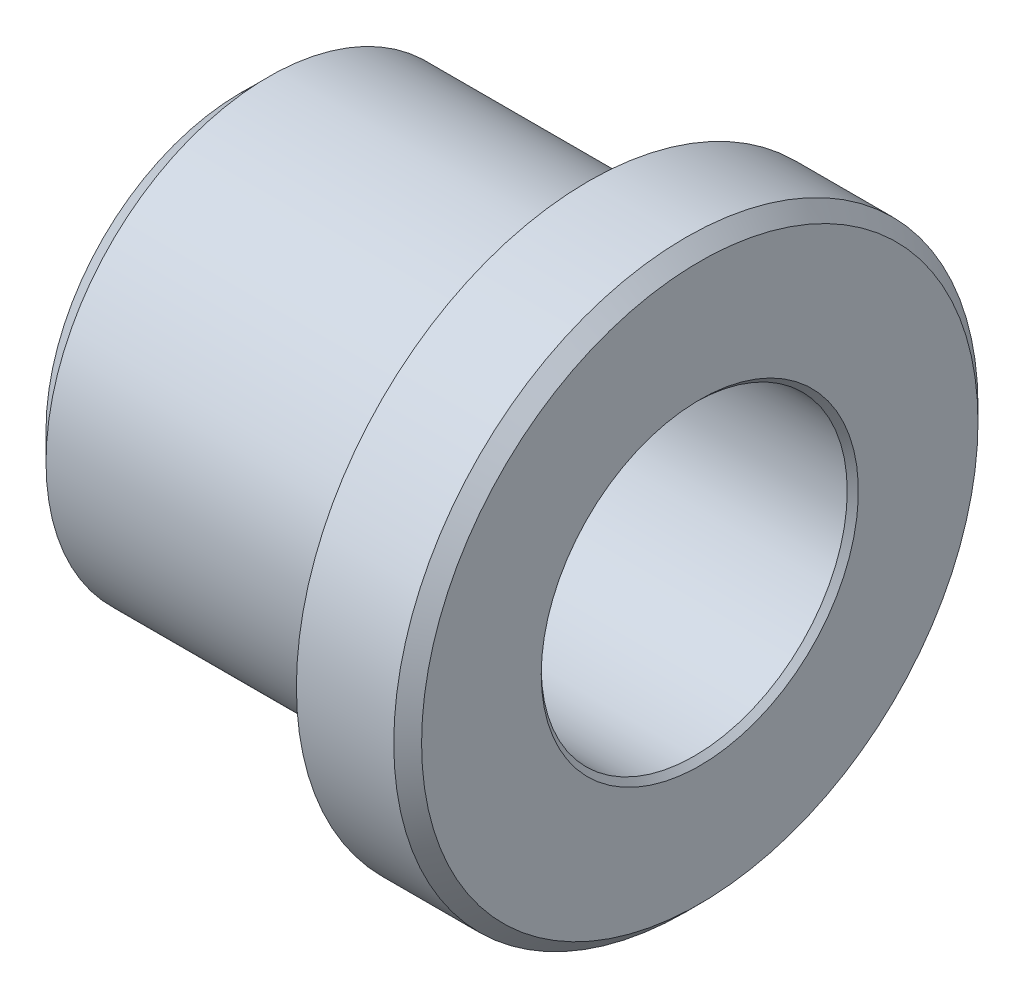
ISO-10303-21;
HEADER;
FILE_DESCRIPTION(('STEP AP214'),'2;1');
FILE_NAME('part.step','',(''),(''),'','','');
FILE_SCHEMA(('AUTOMOTIVE_DESIGN { 1 0 10303 214 1 1 1 1 }'));
ENDSEC;
DATA;
#1=APPLICATION_CONTEXT('core data for automotive mechanical design processes');
#2=APPLICATION_PROTOCOL_DEFINITION('international standard','automotive_design',2000,#1);
#3=PRODUCT_CONTEXT('',#1,'mechanical');
#4=PRODUCT('Part','Part','',(#3));
#5=PRODUCT_RELATED_PRODUCT_CATEGORY('part','',(#4));
#6=PRODUCT_DEFINITION_FORMATION('','',#4);
#7=PRODUCT_DEFINITION_CONTEXT('part definition',#1,'design');
#8=PRODUCT_DEFINITION('design','',#6,#7);
#9=PRODUCT_DEFINITION_SHAPE('','',#8);
#10=(LENGTH_UNIT() NAMED_UNIT(*) SI_UNIT(.MILLI.,.METRE.));
#11=(NAMED_UNIT(*) PLANE_ANGLE_UNIT() SI_UNIT($,.RADIAN.));
#12=(NAMED_UNIT(*) SI_UNIT($,.STERADIAN.) SOLID_ANGLE_UNIT());
#13=UNCERTAINTY_MEASURE_WITH_UNIT(LENGTH_MEASURE(1.E-05),#10,'distance_accuracy_value','');
#14=(GEOMETRIC_REPRESENTATION_CONTEXT(3) GLOBAL_UNCERTAINTY_ASSIGNED_CONTEXT((#13)) GLOBAL_UNIT_ASSIGNED_CONTEXT((#10,
#11,#12)) REPRESENTATION_CONTEXT('',''));
#15=CARTESIAN_POINT('',(0.,0.,0.));
#16=DIRECTION('',(0.,0.,1.));
#17=DIRECTION('',(1.,0.,0.));
#18=AXIS2_PLACEMENT_3D('',#15,#16,#17);
#19=CARTESIAN_POINT('',(12.5,10.5,0.));
#20=DIRECTION('',(1.,0.,0.));
#21=DIRECTION('',(0.,0.,-1.));
#22=AXIS2_PLACEMENT_3D('',#19,#20,#21);
#23=PLANE('',#22);
#24=CARTESIAN_POINT('',(12.5,0.,0.));
#25=DIRECTION('',(-1.,0.,0.));
#26=DIRECTION('',(0.,0.,1.));
#27=AXIS2_PLACEMENT_3D('',#24,#25,#26);
#28=CIRCLE('',#27,8.);
#29=CARTESIAN_POINT('',(12.5,0.,8.));
#30=VERTEX_POINT('',#29);
#31=EDGE_CURVE('E62',#30,#30,#28,.T.);
#32=ORIENTED_EDGE('',*,*,#31,.F.);
#33=EDGE_LOOP('',(#32));
#34=FACE_BOUND('',#33,.T.);
#35=CARTESIAN_POINT('',(12.5,0.,0.));
#36=DIRECTION('',(-1.,0.,0.));
#37=DIRECTION('',(0.,0.,1.));
#38=AXIS2_PLACEMENT_3D('',#35,#36,#37);
#39=CIRCLE('',#38,10.5);
#40=CARTESIAN_POINT('',(12.5,0.,10.5));
#41=VERTEX_POINT('',#40);
#42=EDGE_CURVE('E65',#41,#41,#39,.T.);
#43=ORIENTED_EDGE('',*,*,#42,.T.);
#44=EDGE_LOOP('',(#43));
#45=FACE_BOUND('',#44,.T.);
#46=ADVANCED_FACE('F31',(#34,#45),#23,.F.);
#47=CARTESIAN_POINT('',(11.3908279220779,0.,0.));
#48=DIRECTION('',(-1.,0.,0.));
#49=DIRECTION('',(0.,0.,1.));
#50=AXIS2_PLACEMENT_3D('',#47,#48,#49);
#51=CYLINDRICAL_SURFACE('',#50,8.);
#52=CARTESIAN_POINT('',(1.00000000000001,0.,0.));
#53=DIRECTION('',(1.,0.,0.));
#54=DIRECTION('',(0.,0.,-1.));
#55=AXIS2_PLACEMENT_3D('',#52,#53,#54);
#56=CIRCLE('',#55,8.);
#57=CARTESIAN_POINT('',(1.00000000000001,0.,-8.));
#58=VERTEX_POINT('',#57);
#59=EDGE_CURVE('E50',#58,#58,#56,.T.);
#60=ORIENTED_EDGE('',*,*,#59,.T.);
#61=EDGE_LOOP('',(#60));
#62=FACE_BOUND('',#61,.T.);
#63=ORIENTED_EDGE('',*,*,#31,.T.);
#64=EDGE_LOOP('',(#63));
#65=FACE_BOUND('',#64,.T.);
#66=ADVANCED_FACE('F86',(#62,#65),#51,.T.);
#67=CARTESIAN_POINT('',(0.,8.,0.));
#68=DIRECTION('',(1.,0.,0.));
#69=DIRECTION('',(0.,0.,-1.));
#70=AXIS2_PLACEMENT_3D('',#67,#68,#69);
#71=PLANE('',#70);
#72=CARTESIAN_POINT('',(0.,0.,0.));
#73=DIRECTION('',(1.,0.,0.));
#74=DIRECTION('',(0.,0.,-1.));
#75=AXIS2_PLACEMENT_3D('',#72,#73,#74);
#76=CIRCLE('',#75,5.7);
#77=CARTESIAN_POINT('',(0.,0.,-5.7));
#78=VERTEX_POINT('',#77);
#79=EDGE_CURVE('E37',#78,#78,#76,.T.);
#80=ORIENTED_EDGE('',*,*,#79,.T.);
#81=EDGE_LOOP('',(#80));
#82=FACE_BOUND('',#81,.T.);
#83=CARTESIAN_POINT('',(0.,0.,0.));
#84=DIRECTION('',(1.,0.,0.));
#85=DIRECTION('',(0.,0.,-1.));
#86=AXIS2_PLACEMENT_3D('',#83,#84,#85);
#87=CIRCLE('',#86,6.99999999999998);
#88=CARTESIAN_POINT('',(0.,0.,-6.99999999999998));
#89=VERTEX_POINT('',#88);
#90=EDGE_CURVE('E53',#89,#89,#87,.F.);
#91=ORIENTED_EDGE('',*,*,#90,.T.);
#92=EDGE_LOOP('',(#91));
#93=FACE_BOUND('',#92,.T.);
#94=ADVANCED_FACE('F91',(#82,#93),#71,.F.);
#95=CARTESIAN_POINT('',(11.3908279220779,0.,0.));
#96=DIRECTION('',(-1.,0.,0.));
#97=DIRECTION('',(0.,0.,1.));
#98=AXIS2_PLACEMENT_3D('',#95,#96,#97);
#99=CYLINDRICAL_SURFACE('',#98,5.5);
#100=CARTESIAN_POINT('',(0.200000000000004,0.,0.));
#101=DIRECTION('',(1.,0.,0.));
#102=DIRECTION('',(0.,0.,-1.));
#103=AXIS2_PLACEMENT_3D('',#100,#101,#102);
#104=CIRCLE('',#103,5.5);
#105=CARTESIAN_POINT('',(0.200000000000004,0.,-5.5));
#106=VERTEX_POINT('',#105);
#107=EDGE_CURVE('E41',#106,#106,#104,.F.);
#108=ORIENTED_EDGE('',*,*,#107,.T.);
#109=EDGE_LOOP('',(#108));
#110=FACE_BOUND('',#109,.T.);
#111=CARTESIAN_POINT('',(16.3,0.,0.));
#112=DIRECTION('',(-1.,0.,0.));
#113=DIRECTION('',(0.,0.,1.));
#114=AXIS2_PLACEMENT_3D('',#111,#112,#113);
#115=CIRCLE('',#114,5.5);
#116=CARTESIAN_POINT('',(16.3,0.,5.5));
#117=VERTEX_POINT('',#116);
#118=EDGE_CURVE('E45',#117,#117,#115,.F.);
#119=ORIENTED_EDGE('',*,*,#118,.T.);
#120=EDGE_LOOP('',(#119));
#121=FACE_BOUND('',#120,.T.);
#122=ADVANCED_FACE('F83',(#110,#121),#99,.F.);
#123=CARTESIAN_POINT('',(16.5,10.5,0.));
#124=DIRECTION('',(-1.,0.,0.));
#125=DIRECTION('',(0.,0.,1.));
#126=AXIS2_PLACEMENT_3D('',#123,#124,#125);
#127=PLANE('',#126);
#128=CARTESIAN_POINT('',(16.5,0.,0.));
#129=DIRECTION('',(-1.,0.,0.));
#130=DIRECTION('',(0.,0.,1.));
#131=AXIS2_PLACEMENT_3D('',#128,#129,#130);
#132=CIRCLE('',#131,5.7);
#133=CARTESIAN_POINT('',(16.5,0.,5.7));
#134=VERTEX_POINT('',#133);
#135=EDGE_CURVE('E10',#134,#134,#132,.T.);
#136=ORIENTED_EDGE('',*,*,#135,.T.);
#137=EDGE_LOOP('',(#136));
#138=FACE_BOUND('',#137,.T.);
#139=CARTESIAN_POINT('',(16.5,0.,0.));
#140=DIRECTION('',(-1.,0.,0.));
#141=DIRECTION('',(0.,0.,1.));
#142=AXIS2_PLACEMENT_3D('',#139,#140,#141);
#143=CIRCLE('',#142,10.);
#144=CARTESIAN_POINT('',(16.5,0.,10.));
#145=VERTEX_POINT('',#144);
#146=EDGE_CURVE('E56',#145,#145,#143,.F.);
#147=ORIENTED_EDGE('',*,*,#146,.T.);
#148=EDGE_LOOP('',(#147));
#149=FACE_BOUND('',#148,.T.);
#150=ADVANCED_FACE('F73',(#138,#149),#127,.F.);
#151=CARTESIAN_POINT('',(11.3908279220779,0.,0.));
#152=DIRECTION('',(-1.,0.,0.));
#153=DIRECTION('',(0.,0.,1.));
#154=AXIS2_PLACEMENT_3D('',#151,#152,#153);
#155=CYLINDRICAL_SURFACE('',#154,10.5);
#156=CARTESIAN_POINT('',(16.,0.,0.));
#157=DIRECTION('',(-1.,0.,0.));
#158=DIRECTION('',(0.,0.,1.));
#159=AXIS2_PLACEMENT_3D('',#156,#157,#158);
#160=CIRCLE('',#159,10.5);
#161=CARTESIAN_POINT('',(16.,0.,10.5));
#162=VERTEX_POINT('',#161);
#163=EDGE_CURVE('E59',#162,#162,#160,.T.);
#164=ORIENTED_EDGE('',*,*,#163,.T.);
#165=EDGE_LOOP('',(#164));
#166=FACE_BOUND('',#165,.T.);
#167=ORIENTED_EDGE('',*,*,#42,.F.);
#168=EDGE_LOOP('',(#167));
#169=FACE_BOUND('',#168,.T.);
#170=ADVANCED_FACE('F70',(#166,#169),#155,.T.);
#171=CARTESIAN_POINT('',(16.,0.,0.));
#172=DIRECTION('',(-1.,0.,0.));
#173=DIRECTION('',(0.,0.,1.));
#174=AXIS2_PLACEMENT_3D('',#171,#172,#173);
#175=CONICAL_SURFACE('',#174,10.5,0.785398163397445);
#176=ORIENTED_EDGE('',*,*,#146,.F.);
#177=EDGE_LOOP('',(#176));
#178=FACE_BOUND('',#177,.T.);
#179=ORIENTED_EDGE('',*,*,#163,.F.);
#180=EDGE_LOOP('',(#179));
#181=FACE_BOUND('',#180,.T.);
#182=ADVANCED_FACE('F72',(#178,#181),#175,.T.);
#183=CARTESIAN_POINT('',(0.,0.,0.));
#184=DIRECTION('',(1.,0.,0.));
#185=DIRECTION('',(0.,0.,-1.));
#186=AXIS2_PLACEMENT_3D('',#183,#184,#185);
#187=CONICAL_SURFACE('',#186,6.99999999999998,0.785398163397454);
#188=ORIENTED_EDGE('',*,*,#59,.F.);
#189=EDGE_LOOP('',(#188));
#190=FACE_BOUND('',#189,.T.);
#191=ORIENTED_EDGE('',*,*,#90,.F.);
#192=EDGE_LOOP('',(#191));
#193=FACE_BOUND('',#192,.T.);
#194=ADVANCED_FACE('F80',(#190,#193),#187,.T.);
#195=CARTESIAN_POINT('',(0.200000000000004,0.,0.));
#196=DIRECTION('',(-1.,0.,0.));
#197=DIRECTION('',(0.,0.,1.));
#198=AXIS2_PLACEMENT_3D('',#195,#196,#197);
#199=CONICAL_SURFACE('',#198,5.5,0.785398163397446);
#200=ORIENTED_EDGE('',*,*,#79,.F.);
#201=EDGE_LOOP('',(#200));
#202=FACE_BOUND('',#201,.T.);
#203=ORIENTED_EDGE('',*,*,#107,.F.);
#204=EDGE_LOOP('',(#203));
#205=FACE_BOUND('',#204,.T.);
#206=ADVANCED_FACE('F111',(#202,#205),#199,.F.);
#207=CARTESIAN_POINT('',(16.5,0.,0.));
#208=DIRECTION('',(1.,0.,0.));
#209=DIRECTION('',(0.,0.,-1.));
#210=AXIS2_PLACEMENT_3D('',#207,#208,#209);
#211=CONICAL_SURFACE('',#210,5.7,0.78539816339745);
#212=ORIENTED_EDGE('',*,*,#118,.F.);
#213=EDGE_LOOP('',(#212));
#214=FACE_BOUND('',#213,.T.);
#215=ORIENTED_EDGE('',*,*,#135,.F.);
#216=EDGE_LOOP('',(#215));
#217=FACE_BOUND('',#216,.T.);
#218=ADVANCED_FACE('F108',(#214,#217),#211,.F.);
#219=CLOSED_SHELL('',(#46,#66,#94,#122,#150,#170,#182,#194,#206,#218));
#220=MANIFOLD_SOLID_BREP('B2',#219);
#221=ADVANCED_BREP_SHAPE_REPRESENTATION('',(#18,#220),#14);
#222=SHAPE_DEFINITION_REPRESENTATION(#9,#221);
ENDSEC;
END-ISO-10303-21;
